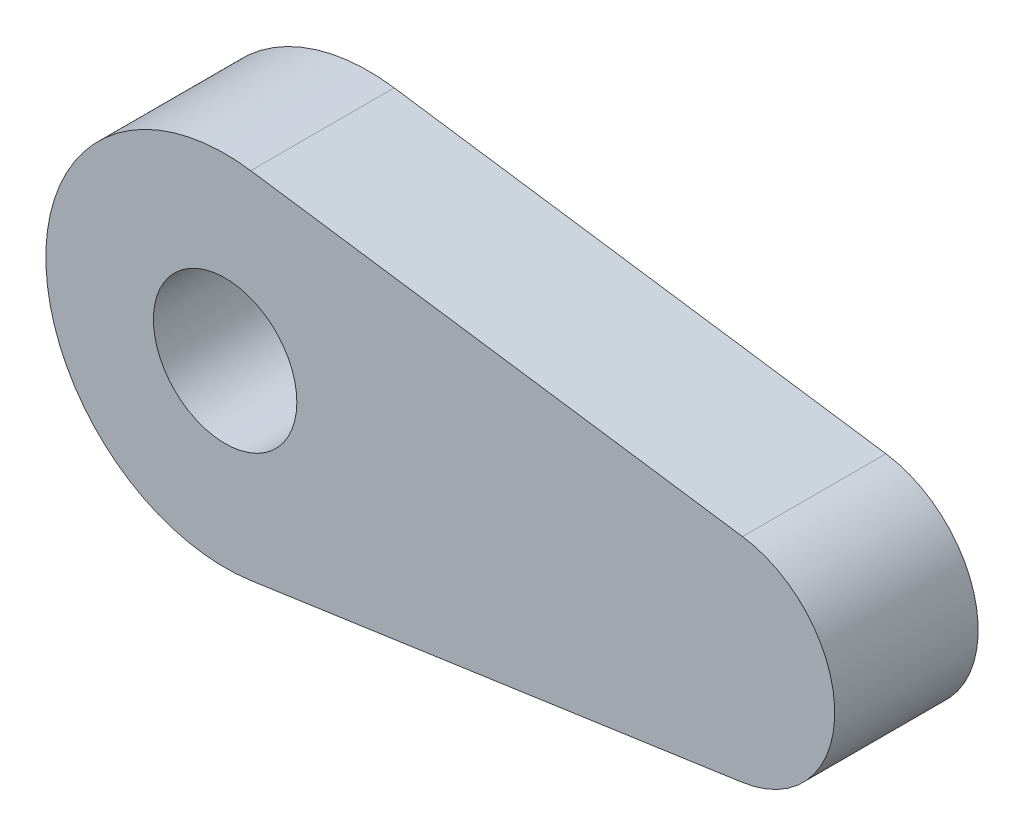
ISO-10303-21;
HEADER;
FILE_DESCRIPTION(('STEP AP214'),'2;1');
FILE_NAME('part.step','',(''),(''),'','','');
FILE_SCHEMA(('AUTOMOTIVE_DESIGN { 1 0 10303 214 1 1 1 1 }'));
ENDSEC;
DATA;
#1=APPLICATION_CONTEXT('core data for automotive mechanical design processes');
#2=APPLICATION_PROTOCOL_DEFINITION('international standard','automotive_design',2000,#1);
#3=PRODUCT_CONTEXT('',#1,'mechanical');
#4=PRODUCT('Part','Part','',(#3));
#5=PRODUCT_RELATED_PRODUCT_CATEGORY('part','',(#4));
#6=PRODUCT_DEFINITION_FORMATION('','',#4);
#7=PRODUCT_DEFINITION_CONTEXT('part definition',#1,'design');
#8=PRODUCT_DEFINITION('design','',#6,#7);
#9=PRODUCT_DEFINITION_SHAPE('','',#8);
#10=(LENGTH_UNIT() NAMED_UNIT(*) SI_UNIT(.MILLI.,.METRE.));
#11=(NAMED_UNIT(*) PLANE_ANGLE_UNIT() SI_UNIT($,.RADIAN.));
#12=(NAMED_UNIT(*) SI_UNIT($,.STERADIAN.) SOLID_ANGLE_UNIT());
#13=UNCERTAINTY_MEASURE_WITH_UNIT(LENGTH_MEASURE(1.E-05),#10,'distance_accuracy_value','');
#14=(GEOMETRIC_REPRESENTATION_CONTEXT(3) GLOBAL_UNCERTAINTY_ASSIGNED_CONTEXT((#13)) GLOBAL_UNIT_ASSIGNED_CONTEXT((#10,
#11,#12)) REPRESENTATION_CONTEXT('',''));
#15=CARTESIAN_POINT('',(0.,0.,0.));
#16=DIRECTION('',(0.,0.,1.));
#17=DIRECTION('',(1.,0.,0.));
#18=AXIS2_PLACEMENT_3D('',#15,#16,#17);
#19=CARTESIAN_POINT('',(-21.8769749018031,0.985183752092192,2.));
#20=DIRECTION('',(0.,0.,1.));
#21=DIRECTION('',(1.,0.,0.));
#22=AXIS2_PLACEMENT_3D('',#19,#20,#21);
#23=PLANE('',#22);
#24=CARTESIAN_POINT('',(-21.8769749018031,0.985183752092192,2.));
#25=DIRECTION('',(0.,0.,1.));
#26=DIRECTION('',(1.,0.,0.));
#27=AXIS2_PLACEMENT_3D('',#24,#25,#26);
#28=CIRCLE('',#27,2.5);
#29=CARTESIAN_POINT('',(-21.5198320446603,3.45954204861916,2.));
#30=VERTEX_POINT('',#29);
#31=CARTESIAN_POINT('',(-21.5198320446602,-1.48917454443478,2.));
#32=VERTEX_POINT('',#31);
#33=EDGE_CURVE('E89',#30,#32,#28,.T.);
#34=ORIENTED_EDGE('',*,*,#33,.T.);
#35=DIRECTION('',(0.989743318610787,0.142857142857143,0.));
#36=VECTOR('',#35,1.);
#37=CARTESIAN_POINT('',(-21.5198320446602,-1.48917454443478,2.));
#38=LINE('',#37,#36);
#39=CARTESIAN_POINT('',(-14.6626891875174,-0.499431225823989,2.));
#40=VERTEX_POINT('',#39);
#41=EDGE_CURVE('E84',#32,#40,#38,.T.);
#42=ORIENTED_EDGE('',*,*,#41,.T.);
#43=CARTESIAN_POINT('',(-14.8769749018031,0.985183752092192,2.));
#44=DIRECTION('',(0.,0.,1.));
#45=DIRECTION('',(1.,0.,0.));
#46=AXIS2_PLACEMENT_3D('',#43,#44,#45);
#47=CIRCLE('',#46,1.5);
#48=CARTESIAN_POINT('',(-14.6626891875174,2.46979873000837,2.));
#49=VERTEX_POINT('',#48);
#50=EDGE_CURVE('E87',#40,#49,#47,.T.);
#51=ORIENTED_EDGE('',*,*,#50,.T.);
#52=DIRECTION('',(-0.989743318610787,0.142857142857143,0.));
#53=VECTOR('',#52,1.);
#54=CARTESIAN_POINT('',(-21.5198320446603,3.45954204861916,2.));
#55=LINE('',#54,#53);
#56=EDGE_CURVE('E54',#49,#30,#55,.T.);
#57=ORIENTED_EDGE('',*,*,#56,.T.);
#58=EDGE_LOOP('',(#34,#42,#51,#57));
#59=FACE_BOUND('',#58,.T.);
#60=CARTESIAN_POINT('',(-21.8769749018031,0.985183752092192,2.));
#61=DIRECTION('',(0.,0.,1.));
#62=DIRECTION('',(1.,0.,0.));
#63=AXIS2_PLACEMENT_3D('',#60,#61,#62);
#64=CIRCLE('',#63,1.);
#65=CARTESIAN_POINT('',(-20.8769749018031,0.985183752092192,2.));
#66=VERTEX_POINT('',#65);
#67=EDGE_CURVE('E104',#66,#66,#64,.T.);
#68=ORIENTED_EDGE('',*,*,#67,.F.);
#69=EDGE_LOOP('',(#68));
#70=FACE_BOUND('',#69,.T.);
#71=ADVANCED_FACE('F37',(#59,#70),#23,.T.);
#72=CARTESIAN_POINT('',(-21.8769749018031,0.985183752092192,0.));
#73=DIRECTION('',(0.,0.,1.));
#74=DIRECTION('',(1.,0.,0.));
#75=AXIS2_PLACEMENT_3D('',#72,#73,#74);
#76=PLANE('',#75);
#77=CARTESIAN_POINT('',(-21.8769749018031,0.985183752092192,0.));
#78=DIRECTION('',(0.,0.,1.));
#79=DIRECTION('',(1.,0.,0.));
#80=AXIS2_PLACEMENT_3D('',#77,#78,#79);
#81=CIRCLE('',#80,2.5);
#82=CARTESIAN_POINT('',(-21.5198320446603,3.45954204861916,0.));
#83=VERTEX_POINT('',#82);
#84=CARTESIAN_POINT('',(-21.5198320446602,-1.48917454443478,0.));
#85=VERTEX_POINT('',#84);
#86=EDGE_CURVE('E101',#83,#85,#81,.T.);
#87=ORIENTED_EDGE('',*,*,#86,.F.);
#88=DIRECTION('',(-0.989743318610787,0.142857142857143,0.));
#89=VECTOR('',#88,1.);
#90=CARTESIAN_POINT('',(-21.5198320446603,3.45954204861916,0.));
#91=LINE('',#90,#89);
#92=CARTESIAN_POINT('',(-14.6626891875174,2.46979873000837,0.));
#93=VERTEX_POINT('',#92);
#94=EDGE_CURVE('E77',#93,#83,#91,.T.);
#95=ORIENTED_EDGE('',*,*,#94,.F.);
#96=CARTESIAN_POINT('',(-14.8769749018031,0.985183752092192,0.));
#97=DIRECTION('',(0.,0.,1.));
#98=DIRECTION('',(1.,0.,0.));
#99=AXIS2_PLACEMENT_3D('',#96,#97,#98);
#100=CIRCLE('',#99,1.5);
#101=CARTESIAN_POINT('',(-14.6626891875174,-0.499431225823989,0.));
#102=VERTEX_POINT('',#101);
#103=EDGE_CURVE('E71',#102,#93,#100,.T.);
#104=ORIENTED_EDGE('',*,*,#103,.F.);
#105=DIRECTION('',(0.989743318610787,0.142857142857143,0.));
#106=VECTOR('',#105,1.);
#107=CARTESIAN_POINT('',(-21.5198320446602,-1.48917454443478,0.));
#108=LINE('',#107,#106);
#109=EDGE_CURVE('E93',#85,#102,#108,.T.);
#110=ORIENTED_EDGE('',*,*,#109,.F.);
#111=EDGE_LOOP('',(#87,#95,#104,#110));
#112=FACE_BOUND('',#111,.T.);
#113=CARTESIAN_POINT('',(-21.8769749018031,0.985183752092192,0.));
#114=DIRECTION('',(0.,0.,1.));
#115=DIRECTION('',(1.,0.,0.));
#116=AXIS2_PLACEMENT_3D('',#113,#114,#115);
#117=CIRCLE('',#116,1.);
#118=CARTESIAN_POINT('',(-20.8769749018031,0.985183752092192,0.));
#119=VERTEX_POINT('',#118);
#120=EDGE_CURVE('E116',#119,#119,#117,.T.);
#121=ORIENTED_EDGE('',*,*,#120,.T.);
#122=EDGE_LOOP('',(#121));
#123=FACE_BOUND('',#122,.T.);
#124=ADVANCED_FACE('F112',(#112,#123),#76,.F.);
#125=CARTESIAN_POINT('',(-21.8769749018031,0.985183752092192,2.));
#126=DIRECTION('',(0.,0.,-1.));
#127=DIRECTION('',(-1.,0.,0.));
#128=AXIS2_PLACEMENT_3D('',#125,#126,#127);
#129=CYLINDRICAL_SURFACE('',#128,2.5);
#130=ORIENTED_EDGE('',*,*,#86,.T.);
#131=DIRECTION('',(0.,0.,-1.));
#132=VECTOR('',#131,1.);
#133=CARTESIAN_POINT('',(-21.5198320446602,-1.48917454443478,2.));
#134=LINE('',#133,#132);
#135=EDGE_CURVE('E11',#32,#85,#134,.T.);
#136=ORIENTED_EDGE('',*,*,#135,.F.);
#137=ORIENTED_EDGE('',*,*,#33,.F.);
#138=DIRECTION('',(0.,0.,-1.));
#139=VECTOR('',#138,1.);
#140=CARTESIAN_POINT('',(-21.5198320446603,3.45954204861916,2.));
#141=LINE('',#140,#139);
#142=EDGE_CURVE('E97',#30,#83,#141,.T.);
#143=ORIENTED_EDGE('',*,*,#142,.T.);
#144=EDGE_LOOP('',(#130,#136,#137,#143));
#145=FACE_BOUND('',#144,.T.);
#146=ADVANCED_FACE('F39',(#145),#129,.T.);
#147=CARTESIAN_POINT('',(-21.5198320446602,-1.48917454443478,2.));
#148=DIRECTION('',(-0.142857142857143,0.989743318610787,0.));
#149=DIRECTION('',(-0.989743318610787,-0.142857142857143,0.));
#150=AXIS2_PLACEMENT_3D('',#147,#148,#149);
#151=PLANE('',#150);
#152=ORIENTED_EDGE('',*,*,#109,.T.);
#153=DIRECTION('',(0.,0.,-1.));
#154=VECTOR('',#153,1.);
#155=CARTESIAN_POINT('',(-14.6626891875174,-0.499431225823989,2.));
#156=LINE('',#155,#154);
#157=EDGE_CURVE('E46',#40,#102,#156,.T.);
#158=ORIENTED_EDGE('',*,*,#157,.F.);
#159=ORIENTED_EDGE('',*,*,#41,.F.);
#160=ORIENTED_EDGE('',*,*,#135,.T.);
#161=EDGE_LOOP('',(#152,#158,#159,#160));
#162=FACE_BOUND('',#161,.T.);
#163=ADVANCED_FACE('F92',(#162),#151,.F.);
#164=CARTESIAN_POINT('',(-14.8769749018031,0.985183752092192,2.));
#165=DIRECTION('',(0.,0.,-1.));
#166=DIRECTION('',(-1.,0.,0.));
#167=AXIS2_PLACEMENT_3D('',#164,#165,#166);
#168=CYLINDRICAL_SURFACE('',#167,1.5);
#169=ORIENTED_EDGE('',*,*,#103,.T.);
#170=DIRECTION('',(0.,0.,-1.));
#171=VECTOR('',#170,1.);
#172=CARTESIAN_POINT('',(-14.6626891875174,2.46979873000837,2.));
#173=LINE('',#172,#171);
#174=EDGE_CURVE('E94',#49,#93,#173,.T.);
#175=ORIENTED_EDGE('',*,*,#174,.F.);
#176=ORIENTED_EDGE('',*,*,#50,.F.);
#177=ORIENTED_EDGE('',*,*,#157,.T.);
#178=EDGE_LOOP('',(#169,#175,#176,#177));
#179=FACE_BOUND('',#178,.T.);
#180=ADVANCED_FACE('F95',(#179),#168,.T.);
#181=CARTESIAN_POINT('',(-21.5198320446603,3.45954204861916,2.));
#182=DIRECTION('',(-0.142857142857143,-0.989743318610787,0.));
#183=DIRECTION('',(0.989743318610787,-0.142857142857143,0.));
#184=AXIS2_PLACEMENT_3D('',#181,#182,#183);
#185=PLANE('',#184);
#186=ORIENTED_EDGE('',*,*,#94,.T.);
#187=ORIENTED_EDGE('',*,*,#142,.F.);
#188=ORIENTED_EDGE('',*,*,#56,.F.);
#189=ORIENTED_EDGE('',*,*,#174,.T.);
#190=EDGE_LOOP('',(#186,#187,#188,#189));
#191=FACE_BOUND('',#190,.T.);
#192=ADVANCED_FACE('F109',(#191),#185,.F.);
#193=CARTESIAN_POINT('',(-21.8769749018031,0.985183752092192,2.));
#194=DIRECTION('',(0.,0.,-1.));
#195=DIRECTION('',(-1.,0.,0.));
#196=AXIS2_PLACEMENT_3D('',#193,#194,#195);
#197=CYLINDRICAL_SURFACE('',#196,1.);
#198=ORIENTED_EDGE('',*,*,#67,.T.);
#199=EDGE_LOOP('',(#198));
#200=FACE_BOUND('',#199,.T.);
#201=ORIENTED_EDGE('',*,*,#120,.F.);
#202=EDGE_LOOP('',(#201));
#203=FACE_BOUND('',#202,.T.);
#204=ADVANCED_FACE('F122',(#200,#203),#197,.F.);
#205=CLOSED_SHELL('',(#71,#124,#146,#163,#180,#192,#204));
#206=MANIFOLD_SOLID_BREP('B2',#205);
#207=ADVANCED_BREP_SHAPE_REPRESENTATION('',(#18,#206),#14);
#208=SHAPE_DEFINITION_REPRESENTATION(#9,#207);
ENDSEC;
END-ISO-10303-21;
